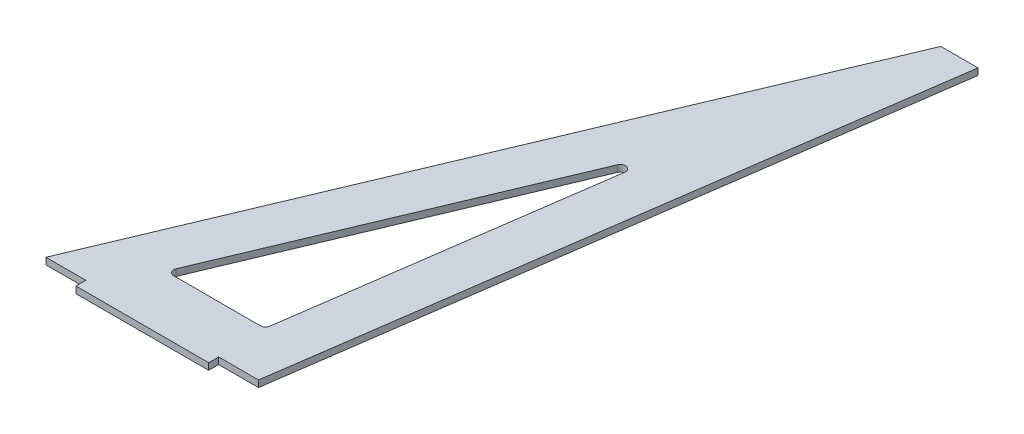
ISO-10303-21;
HEADER;
FILE_DESCRIPTION(('STEP AP214'),'2;1');
FILE_NAME('part.step','',(''),(''),'','','');
FILE_SCHEMA(('AUTOMOTIVE_DESIGN { 1 0 10303 214 1 1 1 1 }'));
ENDSEC;
DATA;
#1=APPLICATION_CONTEXT('core data for automotive mechanical design processes');
#2=APPLICATION_PROTOCOL_DEFINITION('international standard','automotive_design',2000,#1);
#3=PRODUCT_CONTEXT('',#1,'mechanical');
#4=PRODUCT('Part','Part','',(#3));
#5=PRODUCT_RELATED_PRODUCT_CATEGORY('part','',(#4));
#6=PRODUCT_DEFINITION_FORMATION('','',#4);
#7=PRODUCT_DEFINITION_CONTEXT('part definition',#1,'design');
#8=PRODUCT_DEFINITION('design','',#6,#7);
#9=PRODUCT_DEFINITION_SHAPE('','',#8);
#10=(LENGTH_UNIT() NAMED_UNIT(*) SI_UNIT(.MILLI.,.METRE.));
#11=(NAMED_UNIT(*) PLANE_ANGLE_UNIT() SI_UNIT($,.RADIAN.));
#12=(NAMED_UNIT(*) SI_UNIT($,.STERADIAN.) SOLID_ANGLE_UNIT());
#13=UNCERTAINTY_MEASURE_WITH_UNIT(LENGTH_MEASURE(1.E-05),#10,'distance_accuracy_value','');
#14=(GEOMETRIC_REPRESENTATION_CONTEXT(3) GLOBAL_UNCERTAINTY_ASSIGNED_CONTEXT((#13)) GLOBAL_UNIT_ASSIGNED_CONTEXT((#10,
#11,#12)) REPRESENTATION_CONTEXT('',''));
#15=CARTESIAN_POINT('',(0.,0.,0.));
#16=DIRECTION('',(0.,0.,1.));
#17=DIRECTION('',(1.,0.,0.));
#18=AXIS2_PLACEMENT_3D('',#15,#16,#17);
#19=CARTESIAN_POINT('',(-42.7949237056991,3.175,0.));
#20=DIRECTION('',(0.,0.,-1.));
#21=DIRECTION('',(-1.,0.,0.));
#22=AXIS2_PLACEMENT_3D('',#19,#20,#21);
#23=PLANE('',#22);
#24=DIRECTION('',(0.,1.,0.));
#25=VECTOR('',#24,1.);
#26=CARTESIAN_POINT('',(-61.8449237056991,3.175,0.));
#27=LINE('',#26,#25);
#28=CARTESIAN_POINT('',(-61.8449237056991,0.,0.));
#29=VERTEX_POINT('',#28);
#30=CARTESIAN_POINT('',(-61.8449237056991,3.175,0.));
#31=VERTEX_POINT('',#30);
#32=EDGE_CURVE('E160',#29,#31,#27,.T.);
#33=ORIENTED_EDGE('',*,*,#32,.F.);
#34=DIRECTION('',(1.,0.,0.));
#35=VECTOR('',#34,1.);
#36=CARTESIAN_POINT('',(-42.7949237056991,0.,0.));
#37=LINE('',#36,#35);
#38=CARTESIAN_POINT('',(-42.7949237056991,0.,0.));
#39=VERTEX_POINT('',#38);
#40=EDGE_CURVE('E199',#29,#39,#37,.T.);
#41=ORIENTED_EDGE('',*,*,#40,.T.);
#42=DIRECTION('',(0.,-1.,0.));
#43=VECTOR('',#42,1.);
#44=CARTESIAN_POINT('',(-42.7949237056991,3.175,0.));
#45=LINE('',#44,#43);
#46=CARTESIAN_POINT('',(-42.7949237056991,3.175,0.));
#47=VERTEX_POINT('',#46);
#48=EDGE_CURVE('E205',#47,#39,#45,.T.);
#49=ORIENTED_EDGE('',*,*,#48,.F.);
#50=DIRECTION('',(1.,0.,0.));
#51=VECTOR('',#50,1.);
#52=CARTESIAN_POINT('',(-42.7949237056991,3.175,0.));
#53=LINE('',#52,#51);
#54=EDGE_CURVE('E52',#31,#47,#53,.T.);
#55=ORIENTED_EDGE('',*,*,#54,.F.);
#56=EDGE_LOOP('',(#33,#41,#49,#55));
#57=FACE_BOUND('',#56,.T.);
#58=ADVANCED_FACE('F37',(#57),#23,.F.);
#59=DIRECTION('',(0.,-1.,0.));
#60=VECTOR('',#59,1.);
#61=CARTESIAN_POINT('',(-125.344923705699,3.175,0.));
#62=LINE('',#61,#60);
#63=CARTESIAN_POINT('',(-125.344923705699,3.175,0.));
#64=VERTEX_POINT('',#63);
#65=CARTESIAN_POINT('',(-125.344923705699,0.,0.));
#66=VERTEX_POINT('',#65);
#67=EDGE_CURVE('E60',#64,#66,#62,.T.);
#68=ORIENTED_EDGE('',*,*,#67,.F.);
#69=CARTESIAN_POINT('',(-144.394923705699,3.175,0.));
#70=VERTEX_POINT('',#69);
#71=EDGE_CURVE('E190',#70,#64,#53,.T.);
#72=ORIENTED_EDGE('',*,*,#71,.F.);
#73=DIRECTION('',(0.,-1.,0.));
#74=VECTOR('',#73,1.);
#75=CARTESIAN_POINT('',(-144.394923705699,3.175,0.));
#76=LINE('',#75,#74);
#77=CARTESIAN_POINT('',(-144.394923705699,0.,0.));
#78=VERTEX_POINT('',#77);
#79=EDGE_CURVE('E208',#70,#78,#76,.T.);
#80=ORIENTED_EDGE('',*,*,#79,.T.);
#81=EDGE_CURVE('E200',#78,#66,#37,.T.);
#82=ORIENTED_EDGE('',*,*,#81,.T.);
#83=EDGE_LOOP('',(#68,#72,#80,#82));
#84=FACE_BOUND('',#83,.T.);
#85=ADVANCED_FACE('F273',(#84),#23,.F.);
#86=CARTESIAN_POINT('',(-17.78,3.175,-301.244));
#87=DIRECTION('',(0.,0.,1.));
#88=DIRECTION('',(1.,0.,0.));
#89=AXIS2_PLACEMENT_3D('',#86,#87,#88);
#90=PLANE('',#89);
#91=DIRECTION('',(-1.,0.,0.));
#92=VECTOR('',#91,1.);
#93=CARTESIAN_POINT('',(-17.78,0.,-301.244));
#94=LINE('',#93,#92);
#95=CARTESIAN_POINT('',(0.,0.,-301.244));
#96=VERTEX_POINT('',#95);
#97=CARTESIAN_POINT('',(-17.78,0.,-301.244));
#98=VERTEX_POINT('',#97);
#99=EDGE_CURVE('E184',#96,#98,#94,.T.);
#100=ORIENTED_EDGE('',*,*,#99,.T.);
#101=DIRECTION('',(0.,-1.,0.));
#102=VECTOR('',#101,1.);
#103=CARTESIAN_POINT('',(-17.78,3.175,-301.244));
#104=LINE('',#103,#102);
#105=CARTESIAN_POINT('',(-17.78,3.175,-301.244));
#106=VERTEX_POINT('',#105);
#107=EDGE_CURVE('E211',#106,#98,#104,.T.);
#108=ORIENTED_EDGE('',*,*,#107,.F.);
#109=DIRECTION('',(-1.,0.,0.));
#110=VECTOR('',#109,1.);
#111=CARTESIAN_POINT('',(-17.78,3.175,-301.244));
#112=LINE('',#111,#110);
#113=CARTESIAN_POINT('',(0.,3.175,-301.244));
#114=VERTEX_POINT('',#113);
#115=EDGE_CURVE('E185',#114,#106,#112,.T.);
#116=ORIENTED_EDGE('',*,*,#115,.F.);
#117=DIRECTION('',(0.,-1.,0.));
#118=VECTOR('',#117,1.);
#119=CARTESIAN_POINT('',(0.,3.175,-301.244));
#120=LINE('',#119,#118);
#121=EDGE_CURVE('E194',#114,#96,#120,.T.);
#122=ORIENTED_EDGE('',*,*,#121,.T.);
#123=EDGE_LOOP('',(#100,#108,#116,#122));
#124=FACE_BOUND('',#123,.T.);
#125=ADVANCED_FACE('F278',(#124),#90,.F.);
#126=CARTESIAN_POINT('',(-144.394923705699,3.175,0.));
#127=DIRECTION('',(0.921881072677808,0.,0.387472951105512));
#128=DIRECTION('',(0.387472951105512,0.,-0.921881072677808));
#129=AXIS2_PLACEMENT_3D('',#126,#127,#128);
#130=PLANE('',#129);
#131=DIRECTION('',(-0.387472951105512,0.,0.921881072677808));
#132=VECTOR('',#131,1.);
#133=CARTESIAN_POINT('',(-144.394923705699,0.,0.));
#134=LINE('',#133,#132);
#135=EDGE_CURVE('E197',#98,#78,#134,.T.);
#136=ORIENTED_EDGE('',*,*,#135,.T.);
#137=ORIENTED_EDGE('',*,*,#79,.F.);
#138=DIRECTION('',(-0.387472951105512,0.,0.921881072677808));
#139=VECTOR('',#138,1.);
#140=CARTESIAN_POINT('',(-144.394923705699,3.175,0.));
#141=LINE('',#140,#139);
#142=EDGE_CURVE('E187',#106,#70,#141,.T.);
#143=ORIENTED_EDGE('',*,*,#142,.F.);
#144=ORIENTED_EDGE('',*,*,#107,.T.);
#145=EDGE_LOOP('',(#136,#137,#143,#144));
#146=FACE_BOUND('',#145,.T.);
#147=ADVANCED_FACE('F283',(#146),#130,.F.);
#148=CARTESIAN_POINT('',(0.,3.175,-301.244));
#149=DIRECTION('',(-0.99005959016568,0.,-0.140648526195496));
#150=DIRECTION('',(-0.140648526195496,0.,0.99005959016568));
#151=AXIS2_PLACEMENT_3D('',#148,#149,#150);
#152=PLANE('',#151);
#153=DIRECTION('',(0.140648526195496,0.,-0.99005959016568));
#154=VECTOR('',#153,1.);
#155=CARTESIAN_POINT('',(0.,0.,-301.244));
#156=LINE('',#155,#154);
#157=EDGE_CURVE('E188',#39,#96,#156,.T.);
#158=ORIENTED_EDGE('',*,*,#157,.T.);
#159=ORIENTED_EDGE('',*,*,#121,.F.);
#160=DIRECTION('',(0.140648526195496,0.,-0.99005959016568));
#161=VECTOR('',#160,1.);
#162=CARTESIAN_POINT('',(0.,3.175,-301.244));
#163=LINE('',#162,#161);
#164=EDGE_CURVE('E192',#47,#114,#163,.T.);
#165=ORIENTED_EDGE('',*,*,#164,.F.);
#166=ORIENTED_EDGE('',*,*,#48,.T.);
#167=EDGE_LOOP('',(#158,#159,#165,#166));
#168=FACE_BOUND('',#167,.T.);
#169=ADVANCED_FACE('F281',(#168),#152,.F.);
#170=CARTESIAN_POINT('',(0.,3.175,0.));
#171=DIRECTION('',(0.,-1.,0.));
#172=DIRECTION('',(0.,0.,-1.));
#173=AXIS2_PLACEMENT_3D('',#170,#171,#172);
#174=PLANE('',#173);
#175=DIRECTION('',(-0.387472951105512,0.,0.921881072677808));
#176=VECTOR('',#175,1.);
#177=CARTESIAN_POINT('',(-38.4606900811751,3.175,-193.042545843954));
#178=LINE('',#177,#176);
#179=CARTESIAN_POINT('',(-46.0843125802503,3.175,-174.904316408618));
#180=VERTEX_POINT('',#179);
#181=CARTESIAN_POINT('',(-108.508346174508,3.175,-26.384181295808));
#182=VERTEX_POINT('',#181);
#183=EDGE_CURVE('E175',#180,#182,#178,.T.);
#184=ORIENTED_EDGE('',*,*,#183,.F.);
#185=CARTESIAN_POINT('',(-43.7427346556487,3.175,-173.92013511281));
#186=DIRECTION('',(0.,-1.,0.));
#187=DIRECTION('',(0.,0.,-1.));
#188=AXIS2_PLACEMENT_3D('',#185,#186,#187);
#189=CIRCLE('',#188,2.54);
#190=CARTESIAN_POINT('',(-41.2279832966279,3.175,-173.562887856274));
#191=VERTEX_POINT('',#190);
#192=EDGE_CURVE('E229',#180,#191,#189,.T.);
#193=ORIENTED_EDGE('',*,*,#192,.T.);
#194=DIRECTION('',(0.140648526195496,0.,-0.99005959016568));
#195=VECTOR('',#194,1.);
#196=CARTESIAN_POINT('',(-62.6369361323284,3.175,-22.86));
#197=LINE('',#196,#195);
#198=CARTESIAN_POINT('',(-62.3268528207109,3.175,-25.0427527434634));
#199=VERTEX_POINT('',#198);
#200=EDGE_CURVE('E172',#199,#191,#197,.T.);
#201=ORIENTED_EDGE('',*,*,#200,.F.);
#202=CARTESIAN_POINT('',(-64.8416041797317,3.175,-25.4));
#203=DIRECTION('',(0.,-1.,0.));
#204=DIRECTION('',(0.,0.,-1.));
#205=AXIS2_PLACEMENT_3D('',#202,#203,#204);
#206=CIRCLE('',#205,2.54);
#207=CARTESIAN_POINT('',(-64.8416041797317,3.175,-22.86));
#208=VERTEX_POINT('',#207);
#209=EDGE_CURVE('E45',#199,#208,#206,.T.);
#210=ORIENTED_EDGE('',*,*,#209,.T.);
#211=DIRECTION('',(1.,0.,0.));
#212=VECTOR('',#211,1.);
#213=CARTESIAN_POINT('',(-109.989583795486,3.175,-22.86));
#214=LINE('',#213,#212);
#215=CARTESIAN_POINT('',(-106.166768249907,3.175,-22.86));
#216=VERTEX_POINT('',#215);
#217=EDGE_CURVE('E178',#216,#208,#214,.T.);
#218=ORIENTED_EDGE('',*,*,#217,.F.);
#219=CARTESIAN_POINT('',(-106.166768249907,3.175,-25.4));
#220=DIRECTION('',(0.,-1.,0.));
#221=DIRECTION('',(0.,0.,-1.));
#222=AXIS2_PLACEMENT_3D('',#219,#220,#221);
#223=CIRCLE('',#222,2.54);
#224=EDGE_CURVE('E233',#216,#182,#223,.T.);
#225=ORIENTED_EDGE('',*,*,#224,.T.);
#226=EDGE_LOOP('',(#184,#193,#201,#210,#218,#225));
#227=FACE_BOUND('',#226,.T.);
#228=ORIENTED_EDGE('',*,*,#115,.T.);
#229=ORIENTED_EDGE('',*,*,#142,.T.);
#230=ORIENTED_EDGE('',*,*,#71,.T.);
#231=DIRECTION('',(0.,0.,-1.));
#232=VECTOR('',#231,1.);
#233=CARTESIAN_POINT('',(-125.344923705699,3.175,4.7625));
#234=LINE('',#233,#232);
#235=CARTESIAN_POINT('',(-125.344923705699,3.175,4.7625));
#236=VERTEX_POINT('',#235);
#237=EDGE_CURVE('E145',#236,#64,#234,.T.);
#238=ORIENTED_EDGE('',*,*,#237,.F.);
#239=DIRECTION('',(-1.,0.,0.));
#240=VECTOR('',#239,1.);
#241=CARTESIAN_POINT('',(-125.344923705699,3.175,4.7625));
#242=LINE('',#241,#240);
#243=CARTESIAN_POINT('',(-61.8449237056991,3.175,4.7625));
#244=VERTEX_POINT('',#243);
#245=EDGE_CURVE('E137',#244,#236,#242,.T.);
#246=ORIENTED_EDGE('',*,*,#245,.F.);
#247=DIRECTION('',(0.,0.,-1.));
#248=VECTOR('',#247,1.);
#249=CARTESIAN_POINT('',(-61.8449237056991,3.175,4.7625));
#250=LINE('',#249,#248);
#251=EDGE_CURVE('E142',#244,#31,#250,.T.);
#252=ORIENTED_EDGE('',*,*,#251,.T.);
#253=ORIENTED_EDGE('',*,*,#54,.T.);
#254=ORIENTED_EDGE('',*,*,#164,.T.);
#255=EDGE_LOOP('',(#228,#229,#230,#238,#246,#252,#253,#254));
#256=FACE_BOUND('',#255,.T.);
#257=ADVANCED_FACE('F140',(#227,#256),#174,.F.);
#258=CARTESIAN_POINT('',(0.,0.,0.));
#259=DIRECTION('',(0.,-1.,0.));
#260=DIRECTION('',(0.,0.,-1.));
#261=AXIS2_PLACEMENT_3D('',#258,#259,#260);
#262=PLANE('',#261);
#263=DIRECTION('',(1.,0.,0.));
#264=VECTOR('',#263,1.);
#265=CARTESIAN_POINT('',(-109.989583795486,0.,-22.86));
#266=LINE('',#265,#264);
#267=CARTESIAN_POINT('',(-106.166768249907,0.,-22.86));
#268=VERTEX_POINT('',#267);
#269=CARTESIAN_POINT('',(-64.8416041797317,0.,-22.86));
#270=VERTEX_POINT('',#269);
#271=EDGE_CURVE('E161',#268,#270,#266,.T.);
#272=ORIENTED_EDGE('',*,*,#271,.T.);
#273=CARTESIAN_POINT('',(-64.8416041797317,0.,-25.4));
#274=DIRECTION('',(0.,-1.,0.));
#275=DIRECTION('',(0.,0.,-1.));
#276=AXIS2_PLACEMENT_3D('',#273,#274,#275);
#277=CIRCLE('',#276,2.54);
#278=CARTESIAN_POINT('',(-62.3268528207109,0.,-25.0427527434634));
#279=VERTEX_POINT('',#278);
#280=EDGE_CURVE('E11',#270,#279,#277,.F.);
#281=ORIENTED_EDGE('',*,*,#280,.T.);
#282=DIRECTION('',(0.140648526195496,0.,-0.99005959016568));
#283=VECTOR('',#282,1.);
#284=CARTESIAN_POINT('',(-62.6369361323284,0.,-22.86));
#285=LINE('',#284,#283);
#286=CARTESIAN_POINT('',(-41.2279832966279,0.,-173.562887856274));
#287=VERTEX_POINT('',#286);
#288=EDGE_CURVE('E164',#279,#287,#285,.T.);
#289=ORIENTED_EDGE('',*,*,#288,.T.);
#290=CARTESIAN_POINT('',(-43.7427346556487,0.,-173.92013511281));
#291=DIRECTION('',(0.,-1.,0.));
#292=DIRECTION('',(0.,0.,-1.));
#293=AXIS2_PLACEMENT_3D('',#290,#291,#292);
#294=CIRCLE('',#293,2.54);
#295=CARTESIAN_POINT('',(-46.0843125802503,0.,-174.904316408618));
#296=VERTEX_POINT('',#295);
#297=EDGE_CURVE('E231',#287,#296,#294,.F.);
#298=ORIENTED_EDGE('',*,*,#297,.T.);
#299=DIRECTION('',(-0.387472951105512,0.,0.921881072677808));
#300=VECTOR('',#299,1.);
#301=CARTESIAN_POINT('',(-38.4606900811751,0.,-193.042545843954));
#302=LINE('',#301,#300);
#303=CARTESIAN_POINT('',(-108.508346174508,0.,-26.384181295808));
#304=VERTEX_POINT('',#303);
#305=EDGE_CURVE('E181',#296,#304,#302,.T.);
#306=ORIENTED_EDGE('',*,*,#305,.T.);
#307=CARTESIAN_POINT('',(-106.166768249907,0.,-25.4));
#308=DIRECTION('',(0.,-1.,0.));
#309=DIRECTION('',(0.,0.,-1.));
#310=AXIS2_PLACEMENT_3D('',#307,#308,#309);
#311=CIRCLE('',#310,2.54);
#312=EDGE_CURVE('E235',#304,#268,#311,.F.);
#313=ORIENTED_EDGE('',*,*,#312,.T.);
#314=EDGE_LOOP('',(#272,#281,#289,#298,#306,#313));
#315=FACE_BOUND('',#314,.T.);
#316=ORIENTED_EDGE('',*,*,#99,.F.);
#317=ORIENTED_EDGE('',*,*,#157,.F.);
#318=ORIENTED_EDGE('',*,*,#40,.F.);
#319=DIRECTION('',(0.,0.,-1.));
#320=VECTOR('',#319,1.);
#321=CARTESIAN_POINT('',(-61.8449237056991,0.,4.7625));
#322=LINE('',#321,#320);
#323=CARTESIAN_POINT('',(-61.8449237056991,0.,4.7625));
#324=VERTEX_POINT('',#323);
#325=EDGE_CURVE('E302',#324,#29,#322,.T.);
#326=ORIENTED_EDGE('',*,*,#325,.F.);
#327=DIRECTION('',(1.,0.,0.));
#328=VECTOR('',#327,1.);
#329=CARTESIAN_POINT('',(-125.344923705699,0.,4.7625));
#330=LINE('',#329,#328);
#331=CARTESIAN_POINT('',(-125.344923705699,0.,4.7625));
#332=VERTEX_POINT('',#331);
#333=EDGE_CURVE('E154',#332,#324,#330,.T.);
#334=ORIENTED_EDGE('',*,*,#333,.F.);
#335=DIRECTION('',(0.,0.,-1.));
#336=VECTOR('',#335,1.);
#337=CARTESIAN_POINT('',(-125.344923705699,0.,4.7625));
#338=LINE('',#337,#336);
#339=EDGE_CURVE('E166',#332,#66,#338,.T.);
#340=ORIENTED_EDGE('',*,*,#339,.T.);
#341=ORIENTED_EDGE('',*,*,#81,.F.);
#342=ORIENTED_EDGE('',*,*,#135,.F.);
#343=EDGE_LOOP('',(#316,#317,#318,#326,#334,#340,#341,#342));
#344=FACE_BOUND('',#343,.T.);
#345=ADVANCED_FACE('F250',(#315,#344),#262,.T.);
#346=CARTESIAN_POINT('',(-62.6369361323284,-0.00100000000000013,-22.86));
#347=DIRECTION('',(0.99005959016568,0.,0.140648526195496));
#348=DIRECTION('',(0.140648526195496,0.,-0.99005959016568));
#349=AXIS2_PLACEMENT_3D('',#346,#347,#348);
#350=PLANE('',#349);
#351=ORIENTED_EDGE('',*,*,#200,.T.);
#352=DIRECTION('',(0.,1.,0.));
#353=VECTOR('',#352,1.);
#354=CARTESIAN_POINT('',(-41.2279832966279,0.,-173.562887856274));
#355=LINE('',#354,#353);
#356=EDGE_CURVE('E222',#191,#287,#355,.F.);
#357=ORIENTED_EDGE('',*,*,#356,.T.);
#358=ORIENTED_EDGE('',*,*,#288,.F.);
#359=DIRECTION('',(0.,1.,0.));
#360=VECTOR('',#359,1.);
#361=CARTESIAN_POINT('',(-62.3268528207109,3.175,-25.0427527434634));
#362=LINE('',#361,#360);
#363=EDGE_CURVE('E219',#279,#199,#362,.T.);
#364=ORIENTED_EDGE('',*,*,#363,.T.);
#365=EDGE_LOOP('',(#351,#357,#358,#364));
#366=FACE_BOUND('',#365,.T.);
#367=ADVANCED_FACE('F254',(#366),#350,.F.);
#368=CARTESIAN_POINT('',(-109.989583795486,-0.00100000000000013,-22.86));
#369=DIRECTION('',(0.,0.,1.));
#370=DIRECTION('',(1.,0.,0.));
#371=AXIS2_PLACEMENT_3D('',#368,#369,#370);
#372=PLANE('',#371);
#373=ORIENTED_EDGE('',*,*,#271,.F.);
#374=DIRECTION('',(0.,1.,0.));
#375=VECTOR('',#374,1.);
#376=CARTESIAN_POINT('',(-106.166768249907,3.175,-22.86));
#377=LINE('',#376,#375);
#378=EDGE_CURVE('E226',#268,#216,#377,.T.);
#379=ORIENTED_EDGE('',*,*,#378,.T.);
#380=ORIENTED_EDGE('',*,*,#217,.T.);
#381=DIRECTION('',(0.,1.,0.));
#382=VECTOR('',#381,1.);
#383=CARTESIAN_POINT('',(-64.8416041797317,0.,-22.86));
#384=LINE('',#383,#382);
#385=EDGE_CURVE('E224',#208,#270,#384,.F.);
#386=ORIENTED_EDGE('',*,*,#385,.T.);
#387=EDGE_LOOP('',(#373,#379,#380,#386));
#388=FACE_BOUND('',#387,.T.);
#389=ADVANCED_FACE('F245',(#388),#372,.F.);
#390=CARTESIAN_POINT('',(-38.4606900811751,-0.00100000000000013,-193.042545843954));
#391=DIRECTION('',(-0.921881072677808,0.,-0.387472951105512));
#392=DIRECTION('',(-0.387472951105512,0.,0.921881072677808));
#393=AXIS2_PLACEMENT_3D('',#390,#391,#392);
#394=PLANE('',#393);
#395=ORIENTED_EDGE('',*,*,#305,.F.);
#396=DIRECTION('',(0.,1.,0.));
#397=VECTOR('',#396,1.);
#398=CARTESIAN_POINT('',(-46.0843125802503,3.175,-174.904316408618));
#399=LINE('',#398,#397);
#400=EDGE_CURVE('E216',#296,#180,#399,.T.);
#401=ORIENTED_EDGE('',*,*,#400,.T.);
#402=ORIENTED_EDGE('',*,*,#183,.T.);
#403=DIRECTION('',(0.,1.,0.));
#404=VECTOR('',#403,1.);
#405=CARTESIAN_POINT('',(-108.508346174508,0.,-26.384181295808));
#406=LINE('',#405,#404);
#407=EDGE_CURVE('E214',#182,#304,#406,.F.);
#408=ORIENTED_EDGE('',*,*,#407,.T.);
#409=EDGE_LOOP('',(#395,#401,#402,#408));
#410=FACE_BOUND('',#409,.T.);
#411=ADVANCED_FACE('F262',(#410),#394,.F.);
#412=CARTESIAN_POINT('',(-43.7427346556487,-0.00100000000000013,-173.92013511281));
#413=DIRECTION('',(0.,-1.,0.));
#414=DIRECTION('',(0.,0.,-1.));
#415=AXIS2_PLACEMENT_3D('',#412,#413,#414);
#416=CYLINDRICAL_SURFACE('',#415,2.54);
#417=ORIENTED_EDGE('',*,*,#297,.F.);
#418=ORIENTED_EDGE('',*,*,#356,.F.);
#419=ORIENTED_EDGE('',*,*,#192,.F.);
#420=ORIENTED_EDGE('',*,*,#400,.F.);
#421=EDGE_LOOP('',(#417,#418,#419,#420));
#422=FACE_BOUND('',#421,.T.);
#423=ADVANCED_FACE('F257',(#422),#416,.F.);
#424=CARTESIAN_POINT('',(-106.166768249907,-0.00100000000000013,-25.4));
#425=DIRECTION('',(0.,-1.,0.));
#426=DIRECTION('',(0.,0.,-1.));
#427=AXIS2_PLACEMENT_3D('',#424,#425,#426);
#428=CYLINDRICAL_SURFACE('',#427,2.54);
#429=ORIENTED_EDGE('',*,*,#312,.F.);
#430=ORIENTED_EDGE('',*,*,#407,.F.);
#431=ORIENTED_EDGE('',*,*,#224,.F.);
#432=ORIENTED_EDGE('',*,*,#378,.F.);
#433=EDGE_LOOP('',(#429,#430,#431,#432));
#434=FACE_BOUND('',#433,.T.);
#435=ADVANCED_FACE('F265',(#434),#428,.F.);
#436=CARTESIAN_POINT('',(-64.8416041797317,-0.00100000000000013,-25.4));
#437=DIRECTION('',(0.,-1.,0.));
#438=DIRECTION('',(0.,0.,-1.));
#439=AXIS2_PLACEMENT_3D('',#436,#437,#438);
#440=CYLINDRICAL_SURFACE('',#439,2.54);
#441=ORIENTED_EDGE('',*,*,#280,.F.);
#442=ORIENTED_EDGE('',*,*,#385,.F.);
#443=ORIENTED_EDGE('',*,*,#209,.F.);
#444=ORIENTED_EDGE('',*,*,#363,.F.);
#445=EDGE_LOOP('',(#441,#442,#443,#444));
#446=FACE_BOUND('',#445,.T.);
#447=ADVANCED_FACE('F39',(#446),#440,.F.);
#448=CARTESIAN_POINT('',(-61.8449237056991,3.175,4.7625));
#449=DIRECTION('',(-1.,0.,0.));
#450=DIRECTION('',(0.,0.,1.));
#451=AXIS2_PLACEMENT_3D('',#448,#449,#450);
#452=PLANE('',#451);
#453=ORIENTED_EDGE('',*,*,#32,.T.);
#454=ORIENTED_EDGE('',*,*,#251,.F.);
#455=DIRECTION('',(0.,1.,0.));
#456=VECTOR('',#455,1.);
#457=CARTESIAN_POINT('',(-61.8449237056991,3.175,4.7625));
#458=LINE('',#457,#456);
#459=EDGE_CURVE('E149',#324,#244,#458,.T.);
#460=ORIENTED_EDGE('',*,*,#459,.F.);
#461=ORIENTED_EDGE('',*,*,#325,.T.);
#462=EDGE_LOOP('',(#453,#454,#460,#461));
#463=FACE_BOUND('',#462,.T.);
#464=ADVANCED_FACE('F159',(#463),#452,.F.);
#465=CARTESIAN_POINT('',(-125.344923705699,3.175,4.7625));
#466=DIRECTION('',(1.,0.,0.));
#467=DIRECTION('',(0.,1.,0.));
#468=AXIS2_PLACEMENT_3D('',#465,#466,#467);
#469=PLANE('',#468);
#470=ORIENTED_EDGE('',*,*,#67,.T.);
#471=ORIENTED_EDGE('',*,*,#339,.F.);
#472=DIRECTION('',(0.,-1.,0.));
#473=VECTOR('',#472,1.);
#474=CARTESIAN_POINT('',(-125.344923705699,3.175,4.7625));
#475=LINE('',#474,#473);
#476=EDGE_CURVE('E148',#236,#332,#475,.T.);
#477=ORIENTED_EDGE('',*,*,#476,.F.);
#478=ORIENTED_EDGE('',*,*,#237,.T.);
#479=EDGE_LOOP('',(#470,#471,#477,#478));
#480=FACE_BOUND('',#479,.T.);
#481=ADVANCED_FACE('F310',(#480),#469,.F.);
#482=CARTESIAN_POINT('',(0.,0.,4.7625));
#483=DIRECTION('',(0.,0.,1.));
#484=DIRECTION('',(1.,0.,0.));
#485=AXIS2_PLACEMENT_3D('',#482,#483,#484);
#486=PLANE('',#485);
#487=ORIENTED_EDGE('',*,*,#459,.T.);
#488=ORIENTED_EDGE('',*,*,#245,.T.);
#489=ORIENTED_EDGE('',*,*,#476,.T.);
#490=ORIENTED_EDGE('',*,*,#333,.T.);
#491=EDGE_LOOP('',(#487,#488,#489,#490));
#492=FACE_BOUND('',#491,.T.);
#493=ADVANCED_FACE('F152',(#492),#486,.T.);
#494=CLOSED_SHELL('',(#58,#85,#125,#147,#169,#257,#345,#367,#389,#411,#423,#435,#447,#464,#481,#493));
#495=MANIFOLD_SOLID_BREP('B2',#494);
#496=ADVANCED_BREP_SHAPE_REPRESENTATION('',(#18,#495),#14);
#497=SHAPE_DEFINITION_REPRESENTATION(#9,#496);
ENDSEC;
END-ISO-10303-21;
